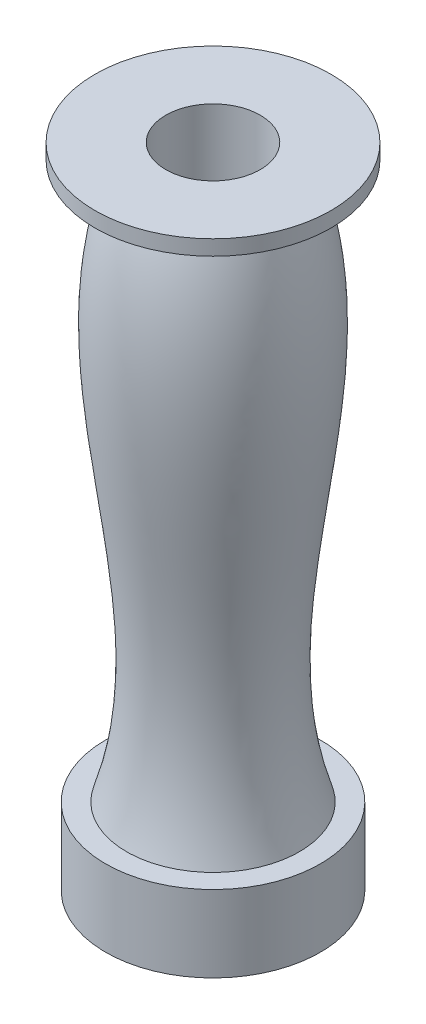
ISO-10303-21;
HEADER;
FILE_DESCRIPTION(('STEP AP214'),'2;1');
FILE_NAME('part.step','',(''),(''),'','','');
FILE_SCHEMA(('AUTOMOTIVE_DESIGN { 1 0 10303 214 1 1 1 1 }'));
ENDSEC;
DATA;
#1=APPLICATION_CONTEXT('core data for automotive mechanical design processes');
#2=APPLICATION_PROTOCOL_DEFINITION('international standard','automotive_design',2000,#1);
#3=PRODUCT_CONTEXT('',#1,'mechanical');
#4=PRODUCT('Part','Part','',(#3));
#5=PRODUCT_RELATED_PRODUCT_CATEGORY('part','',(#4));
#6=PRODUCT_DEFINITION_FORMATION('','',#4);
#7=PRODUCT_DEFINITION_CONTEXT('part definition',#1,'design');
#8=PRODUCT_DEFINITION('design','',#6,#7);
#9=PRODUCT_DEFINITION_SHAPE('','',#8);
#10=(LENGTH_UNIT() NAMED_UNIT(*) SI_UNIT(.MILLI.,.METRE.));
#11=(NAMED_UNIT(*) PLANE_ANGLE_UNIT() SI_UNIT($,.RADIAN.));
#12=(NAMED_UNIT(*) SI_UNIT($,.STERADIAN.) SOLID_ANGLE_UNIT());
#13=UNCERTAINTY_MEASURE_WITH_UNIT(LENGTH_MEASURE(1.E-05),#10,'distance_accuracy_value','');
#14=(GEOMETRIC_REPRESENTATION_CONTEXT(3) GLOBAL_UNCERTAINTY_ASSIGNED_CONTEXT((#13)) GLOBAL_UNIT_ASSIGNED_CONTEXT((#10,
#11,#12)) REPRESENTATION_CONTEXT('',''));
#15=CARTESIAN_POINT('',(0.,0.,0.));
#16=DIRECTION('',(0.,0.,1.));
#17=DIRECTION('',(1.,0.,0.));
#18=AXIS2_PLACEMENT_3D('',#15,#16,#17);
#19=CARTESIAN_POINT('',(-22.7338467898403,0.,0.));
#20=DIRECTION('',(0.,-1.,0.));
#21=DIRECTION('',(1.,0.,0.));
#22=AXIS2_PLACEMENT_3D('',#19,#20,#21);
#23=PLANE('',#22);
#24=CARTESIAN_POINT('',(0.,0.,0.));
#25=DIRECTION('',(0.,1.,0.));
#26=DIRECTION('',(-1.,0.,0.));
#27=AXIS2_PLACEMENT_3D('',#24,#25,#26);
#28=CIRCLE('',#27,22.7338467898403);
#29=CARTESIAN_POINT('',(-22.7338467898403,0.,0.));
#30=VERTEX_POINT('',#29);
#31=EDGE_CURVE('E10',#30,#30,#28,.T.);
#32=ORIENTED_EDGE('',*,*,#31,.F.);
#33=EDGE_LOOP('',(#32));
#34=FACE_BOUND('',#33,.T.);
#35=ADVANCED_FACE('F32',(#34),#23,.T.);
#36=CARTESIAN_POINT('',(0.,150.,0.));
#37=DIRECTION('',(0.,1.,0.));
#38=DIRECTION('',(-1.,0.,0.));
#39=AXIS2_PLACEMENT_3D('',#36,#37,#38);
#40=CYLINDRICAL_SURFACE('',#39,22.7338467898403);
#41=ORIENTED_EDGE('',*,*,#31,.T.);
#42=EDGE_LOOP('',(#41));
#43=FACE_BOUND('',#42,.T.);
#44=CARTESIAN_POINT('',(0.,16.2204959255021,0.));
#45=DIRECTION('',(0.,1.,0.));
#46=DIRECTION('',(-1.,0.,0.));
#47=AXIS2_PLACEMENT_3D('',#44,#45,#46);
#48=CIRCLE('',#47,22.7338467898403);
#49=CARTESIAN_POINT('',(-22.7338467898403,16.2204959255021,0.));
#50=VERTEX_POINT('',#49);
#51=EDGE_CURVE('E38',#50,#50,#48,.T.);
#52=ORIENTED_EDGE('',*,*,#51,.F.);
#53=EDGE_LOOP('',(#52));
#54=FACE_BOUND('',#53,.T.);
#55=ADVANCED_FACE('F85',(#43,#54),#40,.T.);
#56=CARTESIAN_POINT('',(-18.300134272156,16.2204959255021,0.));
#57=DIRECTION('',(0.,1.,0.));
#58=DIRECTION('',(-1.,0.,0.));
#59=AXIS2_PLACEMENT_3D('',#56,#57,#58);
#60=PLANE('',#59);
#61=ORIENTED_EDGE('',*,*,#51,.T.);
#62=EDGE_LOOP('',(#61));
#63=FACE_BOUND('',#62,.T.);
#64=CARTESIAN_POINT('',(0.,16.2204959255021,0.));
#65=DIRECTION('',(0.,1.,0.));
#66=DIRECTION('',(-1.,0.,0.));
#67=AXIS2_PLACEMENT_3D('',#64,#65,#66);
#68=CIRCLE('',#67,18.300134272156);
#69=CARTESIAN_POINT('',(-18.300134272156,16.2204959255021,0.));
#70=VERTEX_POINT('',#69);
#71=EDGE_CURVE('E42',#70,#70,#68,.T.);
#72=ORIENTED_EDGE('',*,*,#71,.F.);
#73=EDGE_LOOP('',(#72));
#74=FACE_BOUND('',#73,.T.);
#75=ADVANCED_FACE('F81',(#63,#74),#60,.T.);
#76=CARTESIAN_POINT('',(-15.,133.958018925568,0.));
#77=CARTESIAN_POINT('',(-30.161473097926,94.4299078606091,0.));
#78=CARTESIAN_POINT('',(-5.6705044726275,55.6734522950973,0.));
#79=CARTESIAN_POINT('',(-18.300134272156,16.2204959255021,0.));
#80=B_SPLINE_CURVE_WITH_KNOTS('',3,(#76,#77,#78,#79),.UNSPECIFIED.,.F.,.F.,(4,4),(0.,1.),.UNSPECIFIED.);
#81=CARTESIAN_POINT('',(0.,150.,0.));
#82=DIRECTION('',(0.,1.,0.));
#83=AXIS1_PLACEMENT('',#81,#82);
#84=SURFACE_OF_REVOLUTION('',#80,#83);
#85=ORIENTED_EDGE('',*,*,#71,.T.);
#86=EDGE_LOOP('',(#85));
#87=FACE_BOUND('',#86,.T.);
#88=CARTESIAN_POINT('',(0.,133.958018925568,0.));
#89=DIRECTION('',(0.,1.,0.));
#90=DIRECTION('',(-1.,0.,0.));
#91=AXIS2_PLACEMENT_3D('',#88,#89,#90);
#92=CIRCLE('',#91,15.);
#93=CARTESIAN_POINT('',(-15.,133.958018925568,0.));
#94=VERTEX_POINT('',#93);
#95=EDGE_CURVE('E46',#94,#94,#92,.T.);
#96=ORIENTED_EDGE('',*,*,#95,.F.);
#97=EDGE_LOOP('',(#96));
#98=FACE_BOUND('',#97,.T.);
#99=ADVANCED_FACE('F76',(#87,#98),#84,.F.);
#100=CARTESIAN_POINT('',(-15.,133.958018925568,0.));
#101=DIRECTION('',(0.,-1.,0.));
#102=DIRECTION('',(1.,0.,0.));
#103=AXIS2_PLACEMENT_3D('',#100,#101,#102);
#104=PLANE('',#103);
#105=ORIENTED_EDGE('',*,*,#95,.T.);
#106=EDGE_LOOP('',(#105));
#107=FACE_BOUND('',#106,.T.);
#108=CARTESIAN_POINT('',(0.,133.958018925568,0.));
#109=DIRECTION('',(0.,1.,0.));
#110=DIRECTION('',(-1.,0.,0.));
#111=AXIS2_PLACEMENT_3D('',#108,#109,#110);
#112=CIRCLE('',#111,25.);
#113=CARTESIAN_POINT('',(-25.,133.958018925568,0.));
#114=VERTEX_POINT('',#113);
#115=EDGE_CURVE('E51',#114,#114,#112,.T.);
#116=ORIENTED_EDGE('',*,*,#115,.F.);
#117=EDGE_LOOP('',(#116));
#118=FACE_BOUND('',#117,.T.);
#119=ADVANCED_FACE('F80',(#107,#118),#104,.T.);
#120=CARTESIAN_POINT('',(0.,150.,0.));
#121=DIRECTION('',(0.,1.,0.));
#122=DIRECTION('',(-1.,0.,0.));
#123=AXIS2_PLACEMENT_3D('',#120,#121,#122);
#124=CYLINDRICAL_SURFACE('',#123,25.);
#125=ORIENTED_EDGE('',*,*,#115,.T.);
#126=EDGE_LOOP('',(#125));
#127=FACE_BOUND('',#126,.T.);
#128=CARTESIAN_POINT('',(0.,137.165116337485,0.));
#129=DIRECTION('',(0.,1.,0.));
#130=DIRECTION('',(-1.,0.,0.));
#131=AXIS2_PLACEMENT_3D('',#128,#129,#130);
#132=CIRCLE('',#131,25.);
#133=CARTESIAN_POINT('',(-25.,137.165116337485,0.));
#134=VERTEX_POINT('',#133);
#135=EDGE_CURVE('E54',#134,#134,#132,.T.);
#136=ORIENTED_EDGE('',*,*,#135,.F.);
#137=EDGE_LOOP('',(#136));
#138=FACE_BOUND('',#137,.T.);
#139=ADVANCED_FACE('F120',(#127,#138),#124,.T.);
#140=CARTESIAN_POINT('',(-25.,137.165116337485,0.));
#141=DIRECTION('',(0.,1.,0.));
#142=DIRECTION('',(-1.,0.,0.));
#143=AXIS2_PLACEMENT_3D('',#140,#141,#142);
#144=PLANE('',#143);
#145=ORIENTED_EDGE('',*,*,#135,.T.);
#146=EDGE_LOOP('',(#145));
#147=FACE_BOUND('',#146,.T.);
#148=CARTESIAN_POINT('',(0.,137.165116337485,0.));
#149=DIRECTION('',(0.,1.,0.));
#150=DIRECTION('',(-1.,0.,0.));
#151=AXIS2_PLACEMENT_3D('',#148,#149,#150);
#152=CIRCLE('',#151,9.99999999999999);
#153=CARTESIAN_POINT('',(-10.,137.165116337485,0.));
#154=VERTEX_POINT('',#153);
#155=EDGE_CURVE('E57',#154,#154,#152,.T.);
#156=ORIENTED_EDGE('',*,*,#155,.F.);
#157=EDGE_LOOP('',(#156));
#158=FACE_BOUND('',#157,.T.);
#159=ADVANCED_FACE('F129',(#147,#158),#144,.T.);
#160=CARTESIAN_POINT('',(0.,150.,0.));
#161=DIRECTION('',(0.,1.,0.));
#162=DIRECTION('',(-1.,0.,0.));
#163=AXIS2_PLACEMENT_3D('',#160,#161,#162);
#164=CYLINDRICAL_SURFACE('',#163,9.99999999999999);
#165=ORIENTED_EDGE('',*,*,#155,.T.);
#166=EDGE_LOOP('',(#165));
#167=FACE_BOUND('',#166,.T.);
#168=CARTESIAN_POINT('',(0.,12.1320264351668,0.));
#169=DIRECTION('',(0.,1.,0.));
#170=DIRECTION('',(-1.,0.,0.));
#171=AXIS2_PLACEMENT_3D('',#168,#169,#170);
#172=CIRCLE('',#171,9.99999999999998);
#173=CARTESIAN_POINT('',(-9.99999999999998,12.1320264351668,0.));
#174=VERTEX_POINT('',#173);
#175=EDGE_CURVE('E60',#174,#174,#172,.T.);
#176=ORIENTED_EDGE('',*,*,#175,.F.);
#177=EDGE_LOOP('',(#176));
#178=FACE_BOUND('',#177,.T.);
#179=ADVANCED_FACE('F138',(#167,#178),#164,.F.);
#180=CARTESIAN_POINT('',(-15.0653908938654,12.1320264351668,0.));
#181=DIRECTION('',(0.,-1.,0.));
#182=DIRECTION('',(1.,0.,0.));
#183=AXIS2_PLACEMENT_3D('',#180,#181,#182);
#184=PLANE('',#183);
#185=ORIENTED_EDGE('',*,*,#175,.T.);
#186=EDGE_LOOP('',(#185));
#187=FACE_BOUND('',#186,.T.);
#188=CARTESIAN_POINT('',(0.,12.1320264351668,0.));
#189=DIRECTION('',(0.,1.,0.));
#190=DIRECTION('',(-1.,0.,0.));
#191=AXIS2_PLACEMENT_3D('',#188,#189,#190);
#192=CIRCLE('',#191,15.0653908938654);
#193=CARTESIAN_POINT('',(-15.0653908938654,12.1320264351668,0.));
#194=VERTEX_POINT('',#193);
#195=EDGE_CURVE('E63',#194,#194,#192,.T.);
#196=ORIENTED_EDGE('',*,*,#195,.F.);
#197=EDGE_LOOP('',(#196));
#198=FACE_BOUND('',#197,.T.);
#199=ADVANCED_FACE('F148',(#187,#198),#184,.T.);
#200=CARTESIAN_POINT('',(0.,150.,0.));
#201=DIRECTION('',(0.,1.,0.));
#202=DIRECTION('',(-1.,0.,0.));
#203=AXIS2_PLACEMENT_3D('',#200,#201,#202);
#204=CYLINDRICAL_SURFACE('',#203,15.0653908938654);
#205=ORIENTED_EDGE('',*,*,#195,.T.);
#206=EDGE_LOOP('',(#205));
#207=FACE_BOUND('',#206,.T.);
#208=CARTESIAN_POINT('',(0.,2.06287017457812,0.));
#209=DIRECTION('',(0.,1.,0.));
#210=DIRECTION('',(-1.,0.,0.));
#211=AXIS2_PLACEMENT_3D('',#208,#209,#210);
#212=CIRCLE('',#211,15.0653908938654);
#213=CARTESIAN_POINT('',(-15.0653908938654,2.06287017457812,0.));
#214=VERTEX_POINT('',#213);
#215=EDGE_CURVE('E66',#214,#214,#212,.T.);
#216=ORIENTED_EDGE('',*,*,#215,.F.);
#217=EDGE_LOOP('',(#216));
#218=FACE_BOUND('',#217,.T.);
#219=ADVANCED_FACE('F158',(#207,#218),#204,.F.);
#220=CARTESIAN_POINT('',(0.,2.06287017457814,0.));
#221=DIRECTION('',(0.,1.,0.));
#222=DIRECTION('',(-1.,0.,0.));
#223=AXIS2_PLACEMENT_3D('',#220,#221,#222);
#224=PLANE('',#223);
#225=ORIENTED_EDGE('',*,*,#215,.T.);
#226=EDGE_LOOP('',(#225));
#227=FACE_BOUND('',#226,.T.);
#228=ADVANCED_FACE('F168',(#227),#224,.T.);
#229=CLOSED_SHELL('',(#35,#55,#75,#99,#119,#139,#159,#179,#199,#219,#228));
#230=MANIFOLD_SOLID_BREP('B2',#229);
#231=ADVANCED_BREP_SHAPE_REPRESENTATION('',(#18,#230),#14);
#232=SHAPE_DEFINITION_REPRESENTATION(#9,#231);
ENDSEC;
END-ISO-10303-21;
